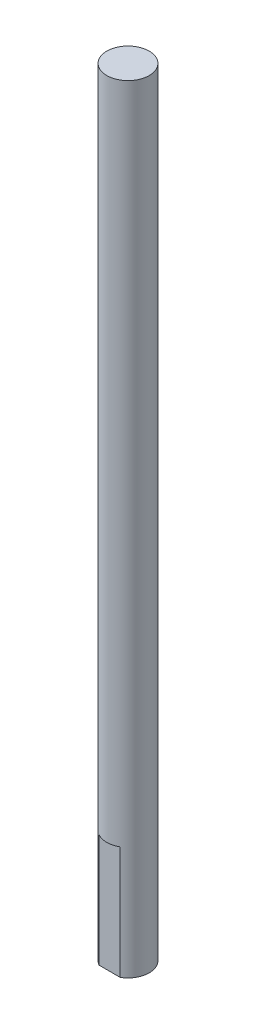
ISO-10303-21;
HEADER;
FILE_DESCRIPTION(('STEP AP214'),'2;1');
FILE_NAME('part.step','',(''),(''),'','','');
FILE_SCHEMA(('AUTOMOTIVE_DESIGN { 1 0 10303 214 1 1 1 1 }'));
ENDSEC;
DATA;
#1=APPLICATION_CONTEXT('core data for automotive mechanical design processes');
#2=APPLICATION_PROTOCOL_DEFINITION('international standard','automotive_design',2000,#1);
#3=PRODUCT_CONTEXT('',#1,'mechanical');
#4=PRODUCT('Part','Part','',(#3));
#5=PRODUCT_RELATED_PRODUCT_CATEGORY('part','',(#4));
#6=PRODUCT_DEFINITION_FORMATION('','',#4);
#7=PRODUCT_DEFINITION_CONTEXT('part definition',#1,'design');
#8=PRODUCT_DEFINITION('design','',#6,#7);
#9=PRODUCT_DEFINITION_SHAPE('','',#8);
#10=(LENGTH_UNIT() NAMED_UNIT(*) SI_UNIT(.MILLI.,.METRE.));
#11=(NAMED_UNIT(*) PLANE_ANGLE_UNIT() SI_UNIT($,.RADIAN.));
#12=(NAMED_UNIT(*) SI_UNIT($,.STERADIAN.) SOLID_ANGLE_UNIT());
#13=UNCERTAINTY_MEASURE_WITH_UNIT(LENGTH_MEASURE(1.E-05),#10,'distance_accuracy_value','');
#14=(GEOMETRIC_REPRESENTATION_CONTEXT(3) GLOBAL_UNCERTAINTY_ASSIGNED_CONTEXT((#13)) GLOBAL_UNIT_ASSIGNED_CONTEXT((#10,
#11,#12)) REPRESENTATION_CONTEXT('',''));
#15=CARTESIAN_POINT('',(0.,0.,0.));
#16=DIRECTION('',(0.,0.,1.));
#17=DIRECTION('',(1.,0.,0.));
#18=AXIS2_PLACEMENT_3D('',#15,#16,#17);
#19=CARTESIAN_POINT('',(0.,55.,0.));
#20=DIRECTION('',(0.,-1.,0.));
#21=DIRECTION('',(0.,0.,-1.));
#22=AXIS2_PLACEMENT_3D('',#19,#20,#21);
#23=CYLINDRICAL_SURFACE('',#22,1.5);
#24=CARTESIAN_POINT('',(0.,55.,0.));
#25=DIRECTION('',(0.,1.,0.));
#26=DIRECTION('',(0.,0.,1.));
#27=AXIS2_PLACEMENT_3D('',#24,#25,#26);
#28=CIRCLE('',#27,1.5);
#29=CARTESIAN_POINT('',(0.,55.,1.5));
#30=VERTEX_POINT('',#29);
#31=EDGE_CURVE('E11',#30,#30,#28,.T.);
#32=ORIENTED_EDGE('',*,*,#31,.F.);
#33=EDGE_LOOP('',(#32));
#34=FACE_BOUND('',#33,.T.);
#35=CARTESIAN_POINT('',(0.,8.,0.));
#36=DIRECTION('',(0.,-1.,0.));
#37=DIRECTION('',(0.,0.,-1.));
#38=AXIS2_PLACEMENT_3D('',#35,#36,#37);
#39=CIRCLE('',#38,1.5);
#40=CARTESIAN_POINT('',(0.748331477354787,8.,1.3));
#41=VERTEX_POINT('',#40);
#42=CARTESIAN_POINT('',(-0.748331477354787,8.,1.3));
#43=VERTEX_POINT('',#42);
#44=EDGE_CURVE('E63',#41,#43,#39,.T.);
#45=ORIENTED_EDGE('',*,*,#44,.F.);
#46=DIRECTION('',(0.,-1.,0.));
#47=VECTOR('',#46,1.);
#48=CARTESIAN_POINT('',(0.748331477354787,8.,1.3));
#49=LINE('',#48,#47);
#50=CARTESIAN_POINT('',(0.748331477354787,0.,1.3));
#51=VERTEX_POINT('',#50);
#52=EDGE_CURVE('E53',#41,#51,#49,.T.);
#53=ORIENTED_EDGE('',*,*,#52,.T.);
#54=CARTESIAN_POINT('',(0.,0.,0.));
#55=DIRECTION('',(0.,1.,0.));
#56=DIRECTION('',(0.,0.,1.));
#57=AXIS2_PLACEMENT_3D('',#54,#55,#56);
#58=CIRCLE('',#57,1.5);
#59=CARTESIAN_POINT('',(-0.748331477354787,0.,1.3));
#60=VERTEX_POINT('',#59);
#61=EDGE_CURVE('E36',#51,#60,#58,.T.);
#62=ORIENTED_EDGE('',*,*,#61,.T.);
#63=DIRECTION('',(0.,-1.,0.));
#64=VECTOR('',#63,1.);
#65=CARTESIAN_POINT('',(-0.748331477354787,8.,1.3));
#66=LINE('',#65,#64);
#67=EDGE_CURVE('E47',#43,#60,#66,.T.);
#68=ORIENTED_EDGE('',*,*,#67,.F.);
#69=EDGE_LOOP('',(#45,#53,#62,#68));
#70=FACE_BOUND('',#69,.T.);
#71=ADVANCED_FACE('F33',(#34,#70),#23,.T.);
#72=CARTESIAN_POINT('',(0.,55.,0.));
#73=DIRECTION('',(0.,1.,0.));
#74=DIRECTION('',(0.,0.,1.));
#75=AXIS2_PLACEMENT_3D('',#72,#73,#74);
#76=PLANE('',#75);
#77=ORIENTED_EDGE('',*,*,#31,.T.);
#78=EDGE_LOOP('',(#77));
#79=FACE_BOUND('',#78,.T.);
#80=ADVANCED_FACE('F70',(#79),#76,.T.);
#81=CARTESIAN_POINT('',(0.,0.,0.));
#82=DIRECTION('',(0.,1.,0.));
#83=DIRECTION('',(0.,0.,1.));
#84=AXIS2_PLACEMENT_3D('',#81,#82,#83);
#85=PLANE('',#84);
#86=ORIENTED_EDGE('',*,*,#61,.F.);
#87=DIRECTION('',(1.,0.,0.));
#88=VECTOR('',#87,1.);
#89=CARTESIAN_POINT('',(-0.748331477354787,0.,1.3));
#90=LINE('',#89,#88);
#91=EDGE_CURVE('E58',#60,#51,#90,.T.);
#92=ORIENTED_EDGE('',*,*,#91,.F.);
#93=EDGE_LOOP('',(#86,#92));
#94=FACE_BOUND('',#93,.T.);
#95=ADVANCED_FACE('F68',(#94),#85,.F.);
#96=CARTESIAN_POINT('',(-0.748331477354787,8.,1.3));
#97=DIRECTION('',(0.,0.,-1.));
#98=DIRECTION('',(-1.,0.,0.));
#99=AXIS2_PLACEMENT_3D('',#96,#97,#98);
#100=PLANE('',#99);
#101=ORIENTED_EDGE('',*,*,#91,.T.);
#102=ORIENTED_EDGE('',*,*,#52,.F.);
#103=DIRECTION('',(1.,0.,0.));
#104=VECTOR('',#103,1.);
#105=CARTESIAN_POINT('',(-0.748331477354787,8.,1.3));
#106=LINE('',#105,#104);
#107=EDGE_CURVE('E113',#43,#41,#106,.T.);
#108=ORIENTED_EDGE('',*,*,#107,.F.);
#109=ORIENTED_EDGE('',*,*,#67,.T.);
#110=EDGE_LOOP('',(#101,#102,#108,#109));
#111=FACE_BOUND('',#110,.T.);
#112=ADVANCED_FACE('F59',(#111),#100,.F.);
#113=CARTESIAN_POINT('',(0.,8.,0.));
#114=DIRECTION('',(0.,-1.,0.));
#115=DIRECTION('',(0.,0.,-1.));
#116=AXIS2_PLACEMENT_3D('',#113,#114,#115);
#117=PLANE('',#116);
#118=ORIENTED_EDGE('',*,*,#44,.T.);
#119=ORIENTED_EDGE('',*,*,#107,.T.);
#120=EDGE_LOOP('',(#118,#119));
#121=FACE_BOUND('',#120,.T.);
#122=ADVANCED_FACE('F75',(#121),#117,.T.);
#123=CLOSED_SHELL('',(#71,#80,#95,#112,#122));
#124=MANIFOLD_SOLID_BREP('B2',#123);
#125=ADVANCED_BREP_SHAPE_REPRESENTATION('',(#18,#124),#14);
#126=SHAPE_DEFINITION_REPRESENTATION(#9,#125);
ENDSEC;
END-ISO-10303-21;
